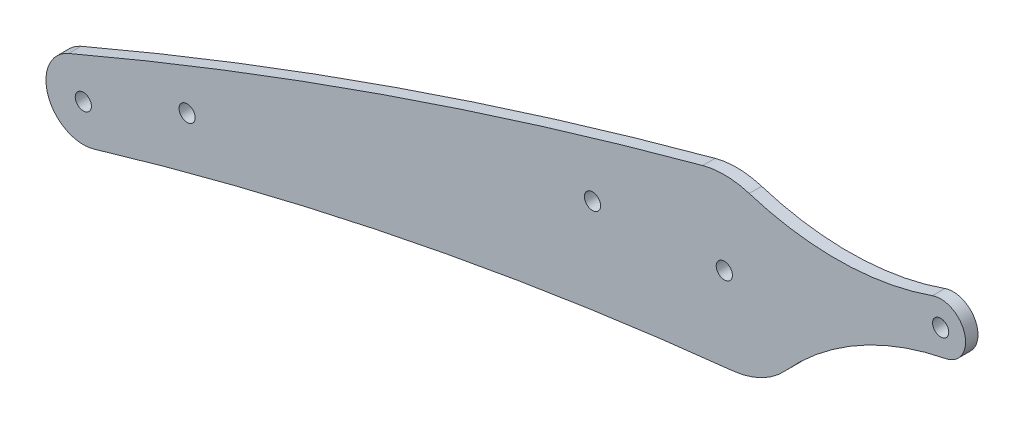
ISO-10303-21;
HEADER;
FILE_DESCRIPTION(('STEP AP214'),'2;1');
FILE_NAME('part.step','',(''),(''),'','','');
FILE_SCHEMA(('AUTOMOTIVE_DESIGN { 1 0 10303 214 1 1 1 1 }'));
ENDSEC;
DATA;
#1=APPLICATION_CONTEXT('core data for automotive mechanical design processes');
#2=APPLICATION_PROTOCOL_DEFINITION('international standard','automotive_design',2000,#1);
#3=PRODUCT_CONTEXT('',#1,'mechanical');
#4=PRODUCT('Part','Part','',(#3));
#5=PRODUCT_RELATED_PRODUCT_CATEGORY('part','',(#4));
#6=PRODUCT_DEFINITION_FORMATION('','',#4);
#7=PRODUCT_DEFINITION_CONTEXT('part definition',#1,'design');
#8=PRODUCT_DEFINITION('design','',#6,#7);
#9=PRODUCT_DEFINITION_SHAPE('','',#8);
#10=(LENGTH_UNIT() NAMED_UNIT(*) SI_UNIT(.MILLI.,.METRE.));
#11=(NAMED_UNIT(*) PLANE_ANGLE_UNIT() SI_UNIT($,.RADIAN.));
#12=(NAMED_UNIT(*) SI_UNIT($,.STERADIAN.) SOLID_ANGLE_UNIT());
#13=UNCERTAINTY_MEASURE_WITH_UNIT(LENGTH_MEASURE(1.E-05),#10,'distance_accuracy_value','');
#14=(GEOMETRIC_REPRESENTATION_CONTEXT(3) GLOBAL_UNCERTAINTY_ASSIGNED_CONTEXT((#13)) GLOBAL_UNIT_ASSIGNED_CONTEXT((#10,
#11,#12)) REPRESENTATION_CONTEXT('',''));
#15=CARTESIAN_POINT('',(0.,0.,0.));
#16=DIRECTION('',(0.,0.,1.));
#17=DIRECTION('',(1.,0.,0.));
#18=AXIS2_PLACEMENT_3D('',#15,#16,#17);
#19=CARTESIAN_POINT('',(-20.5969100874374,247.866229773871,0.));
#20=DIRECTION('',(0.,0.,-1.));
#21=DIRECTION('',(-1.,0.,0.));
#22=AXIS2_PLACEMENT_3D('',#19,#20,#21);
#23=PLANE('',#22);
#24=CARTESIAN_POINT('',(-188.472457343204,162.97946050716,0.));
#25=DIRECTION('',(0.,0.,1.));
#26=DIRECTION('',(1.,0.,0.));
#27=AXIS2_PLACEMENT_3D('',#24,#25,#26);
#28=CIRCLE('',#27,1.94999999999998);
#29=CARTESIAN_POINT('',(-186.522457343204,162.97946050716,0.));
#30=VERTEX_POINT('',#29);
#31=EDGE_CURVE('E208',#30,#30,#28,.T.);
#32=ORIENTED_EDGE('',*,*,#31,.F.);
#33=EDGE_LOOP('',(#32));
#34=FACE_BOUND('',#33,.T.);
#35=CARTESIAN_POINT('',(-163.472457343204,173.083498562728,0.));
#36=DIRECTION('',(0.,0.,1.));
#37=DIRECTION('',(1.,0.,0.));
#38=AXIS2_PLACEMENT_3D('',#35,#36,#37);
#39=CIRCLE('',#38,1.94999999999998);
#40=CARTESIAN_POINT('',(-161.522457343204,173.083498562728,0.));
#41=VERTEX_POINT('',#40);
#42=EDGE_CURVE('E210',#41,#41,#39,.T.);
#43=ORIENTED_EDGE('',*,*,#42,.F.);
#44=EDGE_LOOP('',(#43));
#45=FACE_BOUND('',#44,.T.);
#46=CARTESIAN_POINT('',(-65.8200338691259,203.530407358145,0.));
#47=DIRECTION('',(0.,0.,1.));
#48=DIRECTION('',(1.,0.,0.));
#49=AXIS2_PLACEMENT_3D('',#46,#47,#48);
#50=CIRCLE('',#49,1.94999999999999);
#51=CARTESIAN_POINT('',(-63.8700338691259,203.530407358145,0.));
#52=VERTEX_POINT('',#51);
#53=EDGE_CURVE('E218',#52,#52,#50,.T.);
#54=ORIENTED_EDGE('',*,*,#53,.F.);
#55=EDGE_LOOP('',(#54));
#56=FACE_BOUND('',#55,.T.);
#57=CARTESIAN_POINT('',(-34.0700338691259,204.93052277418,0.));
#58=DIRECTION('',(0.,0.,1.));
#59=DIRECTION('',(1.,0.,0.));
#60=AXIS2_PLACEMENT_3D('',#57,#58,#59);
#61=CIRCLE('',#60,1.94999999999999);
#62=CARTESIAN_POINT('',(-32.1200338691259,204.93052277418,0.));
#63=VERTEX_POINT('',#62);
#64=EDGE_CURVE('E224',#63,#63,#61,.T.);
#65=ORIENTED_EDGE('',*,*,#64,.F.);
#66=EDGE_LOOP('',(#65));
#67=FACE_BOUND('',#66,.T.);
#68=CARTESIAN_POINT('',(-34.0700338691259,204.93052277418,0.));
#69=DIRECTION('',(0.,0.,1.));
#70=DIRECTION('',(-1.,0.,0.));
#71=AXIS2_PLACEMENT_3D('',#68,#69,#70);
#72=CIRCLE('',#71,20.);
#73=CARTESIAN_POINT('',(-28.0819788550421,224.013059218487,0.));
#74=VERTEX_POINT('',#73);
#75=CARTESIAN_POINT('',(-39.2808700103647,224.239774098588,0.));
#76=VERTEX_POINT('',#75);
#77=EDGE_CURVE('E130',#74,#76,#72,.T.);
#78=ORIENTED_EDGE('',*,*,#77,.T.);
#79=CARTESIAN_POINT('',(260.342208110871,-886.042177054882,0.));
#80=DIRECTION('',(0.,0.,1.));
#81=DIRECTION('',(1.,0.,0.));
#82=AXIS2_PLACEMENT_3D('',#79,#80,#81);
#83=CIRCLE('',#82,1150.);
#84=CARTESIAN_POINT('',(-192.012625607084,171.253951951558,0.));
#85=VERTEX_POINT('',#84);
#86=EDGE_CURVE('E133',#76,#85,#83,.T.);
#87=ORIENTED_EDGE('',*,*,#86,.T.);
#88=CARTESIAN_POINT('',(-188.472457343204,162.97946050716,0.));
#89=DIRECTION('',(0.,0.,1.));
#90=DIRECTION('',(1.,0.,0.));
#91=AXIS2_PLACEMENT_3D('',#88,#89,#90);
#92=CIRCLE('',#91,9.00000000000003);
#93=CARTESIAN_POINT('',(-185.905452535124,154.353309203403,0.));
#94=VERTEX_POINT('',#93);
#95=EDGE_CURVE('E137',#85,#94,#92,.T.);
#96=ORIENTED_EDGE('',*,*,#95,.T.);
#97=CARTESIAN_POINT('',(56.533890450219,-660.338758373565,0.));
#98=DIRECTION('',(0.,0.,-1.));
#99=DIRECTION('',(-1.,0.,0.));
#100=AXIS2_PLACEMENT_3D('',#97,#98,#99);
#101=CIRCLE('',#100,850.);
#102=CARTESIAN_POINT('',(-31.9871850341985,185.039274931703,0.));
#103=VERTEX_POINT('',#102);
#104=EDGE_CURVE('E140',#94,#103,#101,.T.);
#105=ORIENTED_EDGE('',*,*,#104,.T.);
#106=CARTESIAN_POINT('',(-34.0700338691259,204.93052277418,0.));
#107=DIRECTION('',(0.,0.,1.));
#108=DIRECTION('',(-1.,0.,0.));
#109=AXIS2_PLACEMENT_3D('',#106,#107,#108);
#110=CIRCLE('',#109,20.);
#111=CARTESIAN_POINT('',(-19.2487087647896,191.501884639523,0.));
#112=VERTEX_POINT('',#111);
#113=EDGE_CURVE('E143',#103,#112,#110,.T.);
#114=ORIENTED_EDGE('',*,*,#113,.T.);
#115=CARTESIAN_POINT('',(32.6259291003873,144.501651168222,0.));
#116=DIRECTION('',(0.,0.,-1.));
#117=DIRECTION('',(-1.,0.,0.));
#118=AXIS2_PLACEMENT_3D('',#115,#116,#117);
#119=CIRCLE('',#118,70.);
#120=CARTESIAN_POINT('',(19.1922428728765,213.200530885003,0.));
#121=VERTEX_POINT('',#120);
#122=EDGE_CURVE('E146',#112,#121,#119,.T.);
#123=ORIENTED_EDGE('',*,*,#122,.T.);
#124=CARTESIAN_POINT('',(18.0407840533756,219.089006289299,0.));
#125=DIRECTION('',(0.,0.,1.));
#126=DIRECTION('',(-1.,0.,0.));
#127=AXIS2_PLACEMENT_3D('',#124,#125,#126);
#128=CIRCLE('',#127,6.00000000000004);
#129=CARTESIAN_POINT('',(16.0541074460763,224.750553432793,0.));
#130=VERTEX_POINT('',#129);
#131=EDGE_CURVE('E107',#121,#130,#128,.T.);
#132=ORIENTED_EDGE('',*,*,#131,.T.);
#133=CARTESIAN_POINT('',(-7.12378630574897,290.801936773561,0.));
#134=DIRECTION('',(0.,0.,-1.));
#135=DIRECTION('',(1.,0.,0.));
#136=AXIS2_PLACEMENT_3D('',#133,#134,#135);
#137=CIRCLE('',#136,70.);
#138=EDGE_CURVE('E149',#130,#74,#137,.T.);
#139=ORIENTED_EDGE('',*,*,#138,.T.);
#140=EDGE_LOOP('',(#78,#87,#96,#105,#114,#123,#132,#139));
#141=FACE_BOUND('',#140,.T.);
#142=CARTESIAN_POINT('',(18.0407840533756,219.089006289299,0.));
#143=DIRECTION('',(0.,0.,1.));
#144=DIRECTION('',(1.,0.,0.));
#145=AXIS2_PLACEMENT_3D('',#142,#143,#144);
#146=CIRCLE('',#145,1.94999999999999);
#147=CARTESIAN_POINT('',(19.9907840533756,219.089006289299,0.));
#148=VERTEX_POINT('',#147);
#149=EDGE_CURVE('E230',#148,#148,#146,.T.);
#150=ORIENTED_EDGE('',*,*,#149,.F.);
#151=EDGE_LOOP('',(#150));
#152=FACE_BOUND('',#151,.T.);
#153=ADVANCED_FACE('F32',(#34,#45,#56,#67,#141,#152),#23,.F.);
#154=CARTESIAN_POINT('',(-34.0700338691259,204.93052277418,-3.));
#155=DIRECTION('',(0.,0.,1.));
#156=DIRECTION('',(1.,0.,0.));
#157=AXIS2_PLACEMENT_3D('',#154,#155,#156);
#158=CYLINDRICAL_SURFACE('',#157,20.);
#159=ORIENTED_EDGE('',*,*,#77,.F.);
#160=DIRECTION('',(0.,0.,1.));
#161=VECTOR('',#160,1.);
#162=CARTESIAN_POINT('',(-28.0819788550421,224.013059218487,-3.));
#163=LINE('',#162,#161);
#164=CARTESIAN_POINT('',(-28.0819788550421,224.013059218487,-3.));
#165=VERTEX_POINT('',#164);
#166=EDGE_CURVE('E11',#165,#74,#163,.T.);
#167=ORIENTED_EDGE('',*,*,#166,.F.);
#168=CARTESIAN_POINT('',(-34.0700338691259,204.93052277418,-3.));
#169=DIRECTION('',(0.,0.,1.));
#170=DIRECTION('',(-1.,0.,0.));
#171=AXIS2_PLACEMENT_3D('',#168,#169,#170);
#172=CIRCLE('',#171,20.);
#173=CARTESIAN_POINT('',(-39.2808700103647,224.239774098588,-3.));
#174=VERTEX_POINT('',#173);
#175=EDGE_CURVE('E151',#165,#174,#172,.T.);
#176=ORIENTED_EDGE('',*,*,#175,.T.);
#177=DIRECTION('',(0.,0.,1.));
#178=VECTOR('',#177,1.);
#179=CARTESIAN_POINT('',(-39.2808700103647,224.239774098588,-3.));
#180=LINE('',#179,#178);
#181=EDGE_CURVE('E36',#174,#76,#180,.T.);
#182=ORIENTED_EDGE('',*,*,#181,.T.);
#183=EDGE_LOOP('',(#159,#167,#176,#182));
#184=FACE_BOUND('',#183,.T.);
#185=ADVANCED_FACE('F34',(#184),#158,.T.);
#186=CARTESIAN_POINT('',(-7.12378630574897,290.801936773561,-3.));
#187=DIRECTION('',(0.,0.,1.));
#188=DIRECTION('',(1.,0.,0.));
#189=AXIS2_PLACEMENT_3D('',#186,#187,#188);
#190=CYLINDRICAL_SURFACE('',#189,70.);
#191=ORIENTED_EDGE('',*,*,#138,.F.);
#192=DIRECTION('',(0.,0.,1.));
#193=VECTOR('',#192,1.);
#194=CARTESIAN_POINT('',(16.0541074460763,224.750553432793,-3.));
#195=LINE('',#194,#193);
#196=CARTESIAN_POINT('',(16.0541074460763,224.750553432793,-3.));
#197=VERTEX_POINT('',#196);
#198=EDGE_CURVE('E42',#197,#130,#195,.T.);
#199=ORIENTED_EDGE('',*,*,#198,.F.);
#200=CARTESIAN_POINT('',(-7.12378630574897,290.801936773561,-3.));
#201=DIRECTION('',(0.,0.,-1.));
#202=DIRECTION('',(1.,0.,0.));
#203=AXIS2_PLACEMENT_3D('',#200,#201,#202);
#204=CIRCLE('',#203,70.);
#205=EDGE_CURVE('E120',#197,#165,#204,.T.);
#206=ORIENTED_EDGE('',*,*,#205,.T.);
#207=ORIENTED_EDGE('',*,*,#166,.T.);
#208=EDGE_LOOP('',(#191,#199,#206,#207));
#209=FACE_BOUND('',#208,.T.);
#210=ADVANCED_FACE('F163',(#209),#190,.F.);
#211=CARTESIAN_POINT('',(18.0407840533756,219.089006289299,-3.));
#212=DIRECTION('',(0.,0.,1.));
#213=DIRECTION('',(1.,0.,0.));
#214=AXIS2_PLACEMENT_3D('',#211,#212,#213);
#215=CYLINDRICAL_SURFACE('',#214,6.00000000000004);
#216=ORIENTED_EDGE('',*,*,#131,.F.);
#217=DIRECTION('',(0.,0.,1.));
#218=VECTOR('',#217,1.);
#219=CARTESIAN_POINT('',(19.1922428728765,213.200530885003,-3.));
#220=LINE('',#219,#218);
#221=CARTESIAN_POINT('',(19.1922428728765,213.200530885003,-3.));
#222=VERTEX_POINT('',#221);
#223=EDGE_CURVE('E102',#222,#121,#220,.T.);
#224=ORIENTED_EDGE('',*,*,#223,.F.);
#225=CARTESIAN_POINT('',(18.0407840533756,219.089006289299,-3.));
#226=DIRECTION('',(0.,0.,1.));
#227=DIRECTION('',(-1.,0.,0.));
#228=AXIS2_PLACEMENT_3D('',#225,#226,#227);
#229=CIRCLE('',#228,6.00000000000004);
#230=EDGE_CURVE('E105',#222,#197,#229,.T.);
#231=ORIENTED_EDGE('',*,*,#230,.T.);
#232=ORIENTED_EDGE('',*,*,#198,.T.);
#233=EDGE_LOOP('',(#216,#224,#231,#232));
#234=FACE_BOUND('',#233,.T.);
#235=ADVANCED_FACE('F104',(#234),#215,.T.);
#236=CARTESIAN_POINT('',(32.6259291003873,144.501651168222,-3.));
#237=DIRECTION('',(0.,0.,1.));
#238=DIRECTION('',(1.,0.,0.));
#239=AXIS2_PLACEMENT_3D('',#236,#237,#238);
#240=CYLINDRICAL_SURFACE('',#239,70.);
#241=ORIENTED_EDGE('',*,*,#122,.F.);
#242=DIRECTION('',(0.,0.,1.));
#243=VECTOR('',#242,1.);
#244=CARTESIAN_POINT('',(-19.2487087647896,191.501884639523,-3.));
#245=LINE('',#244,#243);
#246=CARTESIAN_POINT('',(-19.2487087647896,191.501884639523,-3.));
#247=VERTEX_POINT('',#246);
#248=EDGE_CURVE('E112',#247,#112,#245,.T.);
#249=ORIENTED_EDGE('',*,*,#248,.F.);
#250=CARTESIAN_POINT('',(32.6259291003873,144.501651168222,-3.));
#251=DIRECTION('',(0.,0.,-1.));
#252=DIRECTION('',(-1.,0.,0.));
#253=AXIS2_PLACEMENT_3D('',#250,#251,#252);
#254=CIRCLE('',#253,70.);
#255=EDGE_CURVE('E118',#247,#222,#254,.T.);
#256=ORIENTED_EDGE('',*,*,#255,.T.);
#257=ORIENTED_EDGE('',*,*,#223,.T.);
#258=EDGE_LOOP('',(#241,#249,#256,#257));
#259=FACE_BOUND('',#258,.T.);
#260=ADVANCED_FACE('F122',(#259),#240,.F.);
#261=CARTESIAN_POINT('',(-34.0700338691259,204.93052277418,-3.));
#262=DIRECTION('',(0.,0.,1.));
#263=DIRECTION('',(1.,0.,0.));
#264=AXIS2_PLACEMENT_3D('',#261,#262,#263);
#265=CYLINDRICAL_SURFACE('',#264,20.);
#266=ORIENTED_EDGE('',*,*,#113,.F.);
#267=DIRECTION('',(0.,0.,1.));
#268=VECTOR('',#267,1.);
#269=CARTESIAN_POINT('',(-31.9871850341985,185.039274931703,-3.));
#270=LINE('',#269,#268);
#271=CARTESIAN_POINT('',(-31.9871850341985,185.039274931703,-3.));
#272=VERTEX_POINT('',#271);
#273=EDGE_CURVE('E155',#272,#103,#270,.T.);
#274=ORIENTED_EDGE('',*,*,#273,.F.);
#275=CARTESIAN_POINT('',(-34.0700338691259,204.93052277418,-3.));
#276=DIRECTION('',(0.,0.,1.));
#277=DIRECTION('',(-1.,0.,0.));
#278=AXIS2_PLACEMENT_3D('',#275,#276,#277);
#279=CIRCLE('',#278,20.);
#280=EDGE_CURVE('E123',#272,#247,#279,.T.);
#281=ORIENTED_EDGE('',*,*,#280,.T.);
#282=ORIENTED_EDGE('',*,*,#248,.T.);
#283=EDGE_LOOP('',(#266,#274,#281,#282));
#284=FACE_BOUND('',#283,.T.);
#285=ADVANCED_FACE('F250',(#284),#265,.T.);
#286=CARTESIAN_POINT('',(56.533890450219,-660.338758373565,-3.));
#287=DIRECTION('',(0.,0.,1.));
#288=DIRECTION('',(1.,0.,0.));
#289=AXIS2_PLACEMENT_3D('',#286,#287,#288);
#290=CYLINDRICAL_SURFACE('',#289,850.);
#291=ORIENTED_EDGE('',*,*,#104,.F.);
#292=DIRECTION('',(0.,0.,1.));
#293=VECTOR('',#292,1.);
#294=CARTESIAN_POINT('',(-185.905452535124,154.353309203403,-3.));
#295=LINE('',#294,#293);
#296=CARTESIAN_POINT('',(-185.905452535124,154.353309203403,-3.));
#297=VERTEX_POINT('',#296);
#298=EDGE_CURVE('E157',#297,#94,#295,.T.);
#299=ORIENTED_EDGE('',*,*,#298,.F.);
#300=CARTESIAN_POINT('',(56.533890450219,-660.338758373565,-3.));
#301=DIRECTION('',(0.,0.,-1.));
#302=DIRECTION('',(-1.,0.,0.));
#303=AXIS2_PLACEMENT_3D('',#300,#301,#302);
#304=CIRCLE('',#303,850.);
#305=EDGE_CURVE('E125',#297,#272,#304,.T.);
#306=ORIENTED_EDGE('',*,*,#305,.T.);
#307=ORIENTED_EDGE('',*,*,#273,.T.);
#308=EDGE_LOOP('',(#291,#299,#306,#307));
#309=FACE_BOUND('',#308,.T.);
#310=ADVANCED_FACE('F244',(#309),#290,.F.);
#311=CARTESIAN_POINT('',(-188.472457343204,162.97946050716,-3.));
#312=DIRECTION('',(0.,0.,1.));
#313=DIRECTION('',(1.,0.,0.));
#314=AXIS2_PLACEMENT_3D('',#311,#312,#313);
#315=CYLINDRICAL_SURFACE('',#314,9.00000000000003);
#316=ORIENTED_EDGE('',*,*,#95,.F.);
#317=DIRECTION('',(0.,0.,1.));
#318=VECTOR('',#317,1.);
#319=CARTESIAN_POINT('',(-192.012625607084,171.253951951558,-3.));
#320=LINE('',#319,#318);
#321=CARTESIAN_POINT('',(-192.012625607084,171.253951951558,-3.));
#322=VERTEX_POINT('',#321);
#323=EDGE_CURVE('E158',#322,#85,#320,.T.);
#324=ORIENTED_EDGE('',*,*,#323,.F.);
#325=CARTESIAN_POINT('',(-188.472457343204,162.97946050716,-3.));
#326=DIRECTION('',(0.,0.,1.));
#327=DIRECTION('',(1.,0.,0.));
#328=AXIS2_PLACEMENT_3D('',#325,#326,#327);
#329=CIRCLE('',#328,9.00000000000003);
#330=EDGE_CURVE('E238',#322,#297,#329,.T.);
#331=ORIENTED_EDGE('',*,*,#330,.T.);
#332=ORIENTED_EDGE('',*,*,#298,.T.);
#333=EDGE_LOOP('',(#316,#324,#331,#332));
#334=FACE_BOUND('',#333,.T.);
#335=ADVANCED_FACE('F248',(#334),#315,.T.);
#336=CARTESIAN_POINT('',(260.342208110871,-886.042177054882,-3.));
#337=DIRECTION('',(0.,0.,1.));
#338=DIRECTION('',(1.,0.,0.));
#339=AXIS2_PLACEMENT_3D('',#336,#337,#338);
#340=CYLINDRICAL_SURFACE('',#339,1150.);
#341=ORIENTED_EDGE('',*,*,#86,.F.);
#342=ORIENTED_EDGE('',*,*,#181,.F.);
#343=CARTESIAN_POINT('',(260.342208110871,-886.042177054882,-3.));
#344=DIRECTION('',(0.,0.,1.));
#345=DIRECTION('',(1.,0.,0.));
#346=AXIS2_PLACEMENT_3D('',#343,#344,#345);
#347=CIRCLE('',#346,1150.);
#348=EDGE_CURVE('E236',#174,#322,#347,.T.);
#349=ORIENTED_EDGE('',*,*,#348,.T.);
#350=ORIENTED_EDGE('',*,*,#323,.T.);
#351=EDGE_LOOP('',(#341,#342,#349,#350));
#352=FACE_BOUND('',#351,.T.);
#353=ADVANCED_FACE('F160',(#352),#340,.T.);
#354=CARTESIAN_POINT('',(-20.5969100874374,247.866229773871,-3.));
#355=DIRECTION('',(0.,0.,-1.));
#356=DIRECTION('',(-1.,0.,0.));
#357=AXIS2_PLACEMENT_3D('',#354,#355,#356);
#358=PLANE('',#357);
#359=CARTESIAN_POINT('',(-188.472457343204,162.97946050716,-3.));
#360=DIRECTION('',(0.,0.,-1.));
#361=DIRECTION('',(-1.,0.,0.));
#362=AXIS2_PLACEMENT_3D('',#359,#360,#361);
#363=CIRCLE('',#362,1.94999999999998);
#364=CARTESIAN_POINT('',(-190.422457343204,162.97946050716,-3.));
#365=VERTEX_POINT('',#364);
#366=EDGE_CURVE('E206',#365,#365,#363,.T.);
#367=ORIENTED_EDGE('',*,*,#366,.F.);
#368=EDGE_LOOP('',(#367));
#369=FACE_BOUND('',#368,.T.);
#370=CARTESIAN_POINT('',(-163.472457343204,173.083498562728,-3.));
#371=DIRECTION('',(0.,0.,-1.));
#372=DIRECTION('',(-1.,0.,0.));
#373=AXIS2_PLACEMENT_3D('',#370,#371,#372);
#374=CIRCLE('',#373,1.94999999999998);
#375=CARTESIAN_POINT('',(-165.422457343204,173.083498562728,-3.));
#376=VERTEX_POINT('',#375);
#377=EDGE_CURVE('E215',#376,#376,#374,.T.);
#378=ORIENTED_EDGE('',*,*,#377,.F.);
#379=EDGE_LOOP('',(#378));
#380=FACE_BOUND('',#379,.T.);
#381=CARTESIAN_POINT('',(-65.8200338691259,203.530407358145,-3.));
#382=DIRECTION('',(0.,0.,-1.));
#383=DIRECTION('',(-1.,0.,0.));
#384=AXIS2_PLACEMENT_3D('',#381,#382,#383);
#385=CIRCLE('',#384,1.94999999999999);
#386=CARTESIAN_POINT('',(-67.7700338691259,203.530407358145,-3.));
#387=VERTEX_POINT('',#386);
#388=EDGE_CURVE('E221',#387,#387,#385,.T.);
#389=ORIENTED_EDGE('',*,*,#388,.F.);
#390=EDGE_LOOP('',(#389));
#391=FACE_BOUND('',#390,.T.);
#392=CARTESIAN_POINT('',(-34.0700338691259,204.93052277418,-3.));
#393=DIRECTION('',(0.,0.,-1.));
#394=DIRECTION('',(-1.,0.,0.));
#395=AXIS2_PLACEMENT_3D('',#392,#393,#394);
#396=CIRCLE('',#395,1.94999999999999);
#397=CARTESIAN_POINT('',(-36.0200338691259,204.93052277418,-3.));
#398=VERTEX_POINT('',#397);
#399=EDGE_CURVE('E227',#398,#398,#396,.T.);
#400=ORIENTED_EDGE('',*,*,#399,.F.);
#401=EDGE_LOOP('',(#400));
#402=FACE_BOUND('',#401,.T.);
#403=CARTESIAN_POINT('',(18.0407840533756,219.089006289299,-3.));
#404=DIRECTION('',(0.,0.,-1.));
#405=DIRECTION('',(-1.,0.,0.));
#406=AXIS2_PLACEMENT_3D('',#403,#404,#405);
#407=CIRCLE('',#406,1.94999999999999);
#408=CARTESIAN_POINT('',(16.0907840533756,219.089006289299,-3.));
#409=VERTEX_POINT('',#408);
#410=EDGE_CURVE('E134',#409,#409,#407,.T.);
#411=ORIENTED_EDGE('',*,*,#410,.F.);
#412=EDGE_LOOP('',(#411));
#413=FACE_BOUND('',#412,.T.);
#414=ORIENTED_EDGE('',*,*,#175,.F.);
#415=ORIENTED_EDGE('',*,*,#205,.F.);
#416=ORIENTED_EDGE('',*,*,#230,.F.);
#417=ORIENTED_EDGE('',*,*,#255,.F.);
#418=ORIENTED_EDGE('',*,*,#280,.F.);
#419=ORIENTED_EDGE('',*,*,#305,.F.);
#420=ORIENTED_EDGE('',*,*,#330,.F.);
#421=ORIENTED_EDGE('',*,*,#348,.F.);
#422=EDGE_LOOP('',(#414,#415,#416,#417,#418,#419,#420,#421));
#423=FACE_BOUND('',#422,.T.);
#424=ADVANCED_FACE('F116',(#369,#380,#391,#402,#413,#423),#358,.T.);
#425=CARTESIAN_POINT('',(18.0407840533756,219.089006289299,0.));
#426=DIRECTION('',(0.,0.,1.));
#427=DIRECTION('',(1.,0.,0.));
#428=AXIS2_PLACEMENT_3D('',#425,#426,#427);
#429=CYLINDRICAL_SURFACE('',#428,1.94999999999999);
#430=ORIENTED_EDGE('',*,*,#410,.T.);
#431=EDGE_LOOP('',(#430));
#432=FACE_BOUND('',#431,.T.);
#433=ORIENTED_EDGE('',*,*,#149,.T.);
#434=EDGE_LOOP('',(#433));
#435=FACE_BOUND('',#434,.T.);
#436=ADVANCED_FACE('F181',(#432,#435),#429,.F.);
#437=CARTESIAN_POINT('',(-34.0700338691259,204.93052277418,0.));
#438=DIRECTION('',(0.,0.,1.));
#439=DIRECTION('',(1.,0.,0.));
#440=AXIS2_PLACEMENT_3D('',#437,#438,#439);
#441=CYLINDRICAL_SURFACE('',#440,1.94999999999999);
#442=ORIENTED_EDGE('',*,*,#399,.T.);
#443=EDGE_LOOP('',(#442));
#444=FACE_BOUND('',#443,.T.);
#445=ORIENTED_EDGE('',*,*,#64,.T.);
#446=EDGE_LOOP('',(#445));
#447=FACE_BOUND('',#446,.T.);
#448=ADVANCED_FACE('F185',(#444,#447),#441,.F.);
#449=CARTESIAN_POINT('',(-65.8200338691259,203.530407358145,0.));
#450=DIRECTION('',(0.,0.,1.));
#451=DIRECTION('',(1.,0.,0.));
#452=AXIS2_PLACEMENT_3D('',#449,#450,#451);
#453=CYLINDRICAL_SURFACE('',#452,1.94999999999999);
#454=ORIENTED_EDGE('',*,*,#388,.T.);
#455=EDGE_LOOP('',(#454));
#456=FACE_BOUND('',#455,.T.);
#457=ORIENTED_EDGE('',*,*,#53,.T.);
#458=EDGE_LOOP('',(#457));
#459=FACE_BOUND('',#458,.T.);
#460=ADVANCED_FACE('F189',(#456,#459),#453,.F.);
#461=CARTESIAN_POINT('',(-163.472457343204,173.083498562728,0.));
#462=DIRECTION('',(0.,0.,1.));
#463=DIRECTION('',(1.,0.,0.));
#464=AXIS2_PLACEMENT_3D('',#461,#462,#463);
#465=CYLINDRICAL_SURFACE('',#464,1.94999999999998);
#466=ORIENTED_EDGE('',*,*,#377,.T.);
#467=EDGE_LOOP('',(#466));
#468=FACE_BOUND('',#467,.T.);
#469=ORIENTED_EDGE('',*,*,#42,.T.);
#470=EDGE_LOOP('',(#469));
#471=FACE_BOUND('',#470,.T.);
#472=ADVANCED_FACE('F193',(#468,#471),#465,.F.);
#473=CARTESIAN_POINT('',(-188.472457343204,162.97946050716,0.));
#474=DIRECTION('',(0.,0.,1.));
#475=DIRECTION('',(1.,0.,0.));
#476=AXIS2_PLACEMENT_3D('',#473,#474,#475);
#477=CYLINDRICAL_SURFACE('',#476,1.94999999999998);
#478=ORIENTED_EDGE('',*,*,#366,.T.);
#479=EDGE_LOOP('',(#478));
#480=FACE_BOUND('',#479,.T.);
#481=ORIENTED_EDGE('',*,*,#31,.T.);
#482=EDGE_LOOP('',(#481));
#483=FACE_BOUND('',#482,.T.);
#484=ADVANCED_FACE('F197',(#480,#483),#477,.F.);
#485=CLOSED_SHELL('',(#153,#185,#210,#235,#260,#285,#310,#335,#353,#424,#436,#448,#460,#472,#484));
#486=MANIFOLD_SOLID_BREP('B2',#485);
#487=ADVANCED_BREP_SHAPE_REPRESENTATION('',(#18,#486),#14);
#488=SHAPE_DEFINITION_REPRESENTATION(#9,#487);
ENDSEC;
END-ISO-10303-21;
